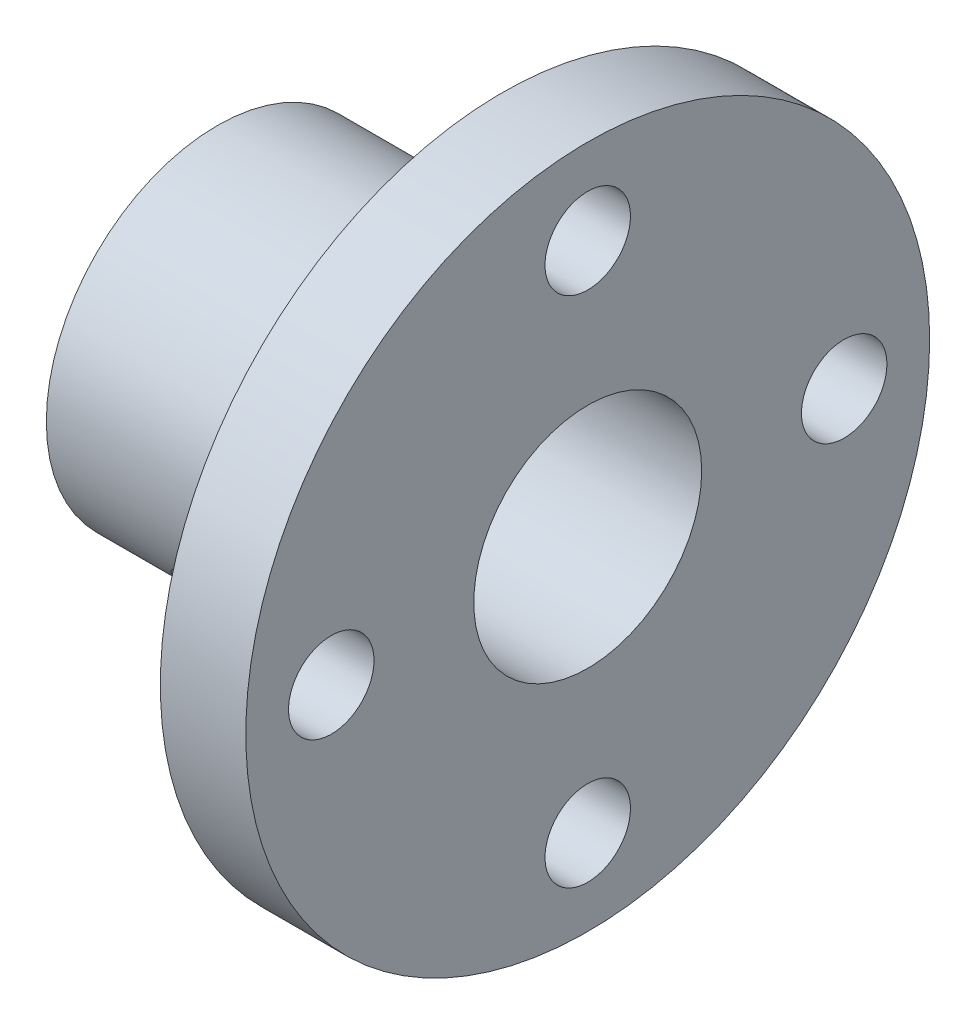
ISO-10303-21;
HEADER;
FILE_DESCRIPTION(('STEP AP214'),'2;1');
FILE_NAME('part.step','',(''),(''),'','','');
FILE_SCHEMA(('AUTOMOTIVE_DESIGN { 1 0 10303 214 1 1 1 1 }'));
ENDSEC;
DATA;
#1=APPLICATION_CONTEXT('core data for automotive mechanical design processes');
#2=APPLICATION_PROTOCOL_DEFINITION('international standard','automotive_design',2000,#1);
#3=PRODUCT_CONTEXT('',#1,'mechanical');
#4=PRODUCT('Part','Part','',(#3));
#5=PRODUCT_RELATED_PRODUCT_CATEGORY('part','',(#4));
#6=PRODUCT_DEFINITION_FORMATION('','',#4);
#7=PRODUCT_DEFINITION_CONTEXT('part definition',#1,'design');
#8=PRODUCT_DEFINITION('design','',#6,#7);
#9=PRODUCT_DEFINITION_SHAPE('','',#8);
#10=(LENGTH_UNIT() NAMED_UNIT(*) SI_UNIT(.MILLI.,.METRE.));
#11=(NAMED_UNIT(*) PLANE_ANGLE_UNIT() SI_UNIT($,.RADIAN.));
#12=(NAMED_UNIT(*) SI_UNIT($,.STERADIAN.) SOLID_ANGLE_UNIT());
#13=UNCERTAINTY_MEASURE_WITH_UNIT(LENGTH_MEASURE(1.E-05),#10,'distance_accuracy_value','');
#14=(GEOMETRIC_REPRESENTATION_CONTEXT(3) GLOBAL_UNCERTAINTY_ASSIGNED_CONTEXT((#13)) GLOBAL_UNIT_ASSIGNED_CONTEXT((#10,
#11,#12)) REPRESENTATION_CONTEXT('',''));
#15=CARTESIAN_POINT('',(0.,0.,0.));
#16=DIRECTION('',(0.,0.,1.));
#17=DIRECTION('',(1.,0.,0.));
#18=AXIS2_PLACEMENT_3D('',#15,#16,#17);
#19=CARTESIAN_POINT('',(0.,0.,0.));
#20=DIRECTION('',(1.,0.,0.));
#21=DIRECTION('',(0.,0.,-1.));
#22=AXIS2_PLACEMENT_3D('',#19,#20,#21);
#23=PLANE('',#22);
#24=CARTESIAN_POINT('',(0.,0.,0.));
#25=DIRECTION('',(1.,0.,0.));
#26=DIRECTION('',(0.,0.,-1.));
#27=AXIS2_PLACEMENT_3D('',#24,#25,#26);
#28=CIRCLE('',#27,6.);
#29=CARTESIAN_POINT('',(0.,0.,-6.));
#30=VERTEX_POINT('',#29);
#31=EDGE_CURVE('E53',#30,#30,#28,.T.);
#32=ORIENTED_EDGE('',*,*,#31,.F.);
#33=EDGE_LOOP('',(#32));
#34=FACE_BOUND('',#33,.T.);
#35=CARTESIAN_POINT('',(0.,0.,0.));
#36=DIRECTION('',(1.,0.,0.));
#37=DIRECTION('',(0.,0.,-1.));
#38=AXIS2_PLACEMENT_3D('',#35,#36,#37);
#39=CIRCLE('',#38,4.);
#40=CARTESIAN_POINT('',(0.,0.,-4.));
#41=VERTEX_POINT('',#40);
#42=EDGE_CURVE('E58',#41,#41,#39,.T.);
#43=ORIENTED_EDGE('',*,*,#42,.T.);
#44=EDGE_LOOP('',(#43));
#45=FACE_BOUND('',#44,.T.);
#46=ADVANCED_FACE('F39',(#34,#45),#23,.F.);
#47=CARTESIAN_POINT('',(10.,0.,0.));
#48=DIRECTION('',(-1.,0.,0.));
#49=DIRECTION('',(0.,0.,1.));
#50=AXIS2_PLACEMENT_3D('',#47,#48,#49);
#51=CYLINDRICAL_SURFACE('',#50,6.);
#52=CARTESIAN_POINT('',(5.,-5.4142135623731,2.5857864376269));
#53=CARTESIAN_POINT('',(4.89106365032786,-5.41421367339716,2.58578581906464));
#54=CARTESIAN_POINT('',(4.78213040035281,-5.41014819596936,2.59435061016488));
#55=CARTESIAN_POINT('',(4.5674911580115,-5.39384853034686,2.62806786551446));
#56=CARTESIAN_POINT('',(4.46178570025506,-5.38161299656149,2.65322306215945));
#57=CARTESIAN_POINT('',(4.25674621400542,-5.3488916005389,2.71858028002119));
#58=CARTESIAN_POINT('',(4.15740014111457,-5.32842190368199,2.75875280822024));
#59=CARTESIAN_POINT('',(3.96727990290408,-5.27905112475486,2.85208634016736));
#60=CARTESIAN_POINT('',(3.87650763489274,-5.25014818224026,2.90525020949271));
#61=CARTESIAN_POINT('',(3.70256007532337,-5.18252142111875,3.02428686095103));
#62=CARTESIAN_POINT('',(3.61976914265654,-5.14348523672956,3.0905439817752));
#63=CARTESIAN_POINT('',(3.46758639755072,-5.05599212218734,3.23169150911136));
#64=CARTESIAN_POINT('',(3.39819673683526,-5.00753368168853,3.30658329893799));
#65=CARTESIAN_POINT('',(3.27304220534081,-4.89988679131185,3.46416443234016));
#66=CARTESIAN_POINT('',(3.21768005876408,-4.84045137072107,3.54700624081533));
#67=CARTESIAN_POINT('',(3.12481682974498,-4.71233932321494,3.71551329250968));
#68=CARTESIAN_POINT('',(3.08731093364619,-4.64366519326446,3.80117776813358));
#69=CARTESIAN_POINT('',(3.03252829073521,-4.50090376224653,3.96907795478367));
#70=CARTESIAN_POINT('',(3.01459310748599,-4.42708793907423,4.05132926050507));
#71=CARTESIAN_POINT('',(2.99736741327868,-4.27394282930696,4.21257197160515));
#72=CARTESIAN_POINT('',(2.99807209669518,-4.19461496905454,4.29156421195778));
#73=CARTESIAN_POINT('',(3.01768850913206,-4.03610452752903,4.44086239154973));
#74=CARTESIAN_POINT('',(3.03588505694898,-3.95703827682759,4.51138750329879));
#75=CARTESIAN_POINT('',(3.08878596196094,-3.79861472982611,4.64556867451801));
#76=CARTESIAN_POINT('',(3.12349143795965,-3.71925741416244,4.70922426808482));
#77=CARTESIAN_POINT('',(3.20884263461212,-3.56184425761549,4.82941087348064));
#78=CARTESIAN_POINT('',(3.25969187709302,-3.48381923326715,4.8858372428726));
#79=CARTESIAN_POINT('',(3.37571941089731,-3.33281997509248,4.99006423046256));
#80=CARTESIAN_POINT('',(3.44090168665526,-3.2598471531575,5.03786244338138));
#81=CARTESIAN_POINT('',(3.5873487869194,-3.11828582416883,5.12675437642831));
#82=CARTESIAN_POINT('',(3.66922631568296,-3.05006549506492,5.16742648489758));
#83=CARTESIAN_POINT('',(3.84489745145324,-2.92487096421327,5.23930856082371));
#84=CARTESIAN_POINT('',(3.93869289145609,-2.8678984958562,5.27051707025631));
#85=CARTESIAN_POINT('',(4.13730725120688,-2.76721684508803,5.32407948334138));
#86=CARTESIAN_POINT('',(4.24226426263555,-2.72370832873974,5.34630080922881));
#87=CARTESIAN_POINT('',(4.45914278842883,-2.65359259011193,5.38144987823174));
#88=CARTESIAN_POINT('',(4.57106136241249,-2.62697828467492,5.39438151649137));
#89=CARTESIAN_POINT('',(4.79327671082315,-2.59315160007579,5.41072119098235));
#90=CARTESIAN_POINT('',(4.90341884949731,-2.585118056162,5.41453257211109));
#91=CARTESIAN_POINT('',(5.12355229822821,-2.58654184961015,5.4138529870662));
#92=CARTESIAN_POINT('',(5.23354363204798,-2.59599601012327,5.40936352883851));
#93=CARTESIAN_POINT('',(5.44631393142382,-2.63115922354569,5.39234233626926));
#94=CARTESIAN_POINT('',(5.54921086030168,-2.65629875204407,5.38009215808304));
#95=CARTESIAN_POINT('',(5.74908721247837,-2.72090683520427,5.34770631519809));
#96=CARTESIAN_POINT('',(5.84606558318156,-2.76037793006264,5.32756925253977));
#97=CARTESIAN_POINT('',(6.034760841694,-2.85316799229887,5.27847167641872));
#98=CARTESIAN_POINT('',(6.1262132852836,-2.9068864745557,5.24925156110975));
#99=CARTESIAN_POINT('',(6.29829210476744,-3.02510471355213,5.18202259596279));
#100=CARTESIAN_POINT('',(6.37891527732244,-3.08960764776319,5.14401115462803));
#101=CARTESIAN_POINT('',(6.53105596818128,-3.23014676318823,5.05700438380528));
#102=CARTESIAN_POINT('',(6.6019487800377,-3.30658852020751,5.00756858869872));
#103=CARTESIAN_POINT('',(6.72783228469609,-3.46544721381249,4.8989712723706));
#104=CARTESIAN_POINT('',(6.78282354232485,-3.54786393803591,4.83981009671387));
#105=CARTESIAN_POINT('',(6.87484020972343,-3.71494697203409,4.71275910400181));
#106=CARTESIAN_POINT('',(6.91198255429613,-3.79959469801113,4.64492989001615));
#107=CARTESIAN_POINT('',(6.96745548412021,-3.96846376981842,4.50150480650533));
#108=CARTESIAN_POINT('',(6.98579285976101,-4.0526852586219,4.4259117513235));
#109=CARTESIAN_POINT('',(7.00252415521128,-4.21379539240546,4.27267005296268));
#110=CARTESIAN_POINT('',(7.00181490786476,-4.29084263585074,4.19528500631328));
#111=CARTESIAN_POINT('',(6.98268538370718,-4.43954603988725,4.03759502264001));
#112=CARTESIAN_POINT('',(6.96426654369446,-4.51120263731888,3.95729032299928));
#113=CARTESIAN_POINT('',(6.91083553084808,-4.64632974310202,3.79768247393403));
#114=CARTESIAN_POINT('',(6.87609156929414,-4.70991219874281,3.71838367648893));
#115=CARTESIAN_POINT('',(6.79124493780569,-4.82918570269499,3.56211158359779));
#116=CARTESIAN_POINT('',(6.74113948960597,-4.88487532084824,3.48513871158532));
#117=CARTESIAN_POINT('',(6.62486097579599,-4.98975939484983,3.33333625794799));
#118=CARTESIAN_POINT('',(6.55816262923672,-5.03863782850207,3.25869095682417));
#119=CARTESIAN_POINT('',(6.41148521768761,-5.12724670538091,3.11742005634198));
#120=CARTESIAN_POINT('',(6.33150191547454,-5.16697422025102,3.05079702741142));
#121=CARTESIAN_POINT('',(6.1567812888261,-5.23877680945592,2.9258536963133));
#122=CARTESIAN_POINT('',(6.06158897804672,-5.27049145198484,2.867960494574));
#123=CARTESIAN_POINT('',(5.86133114619444,-5.32439565946974,2.76660844157981));
#124=CARTESIAN_POINT('',(5.75626821394067,-5.34658771351053,2.7231458190259));
#125=CARTESIAN_POINT('',(5.54407635196874,-5.38088061308738,2.6547185853755));
#126=CARTESIAN_POINT('',(5.43725547294927,-5.39339225586527,2.62900663504154));
#127=CARTESIAN_POINT('',(5.2202878990666,-5.4100572322686,2.59454380025512));
#128=CARTESIAN_POINT('',(5.11014236517858,-5.41421345011992,2.58578706303715));
#129=CARTESIAN_POINT('',(5.,-5.4142135623731,2.5857864376269));
#130=B_SPLINE_CURVE_WITH_KNOTS('',3,(#52,#53,#54,#55,#56,#57,#58,#59,#60,#61,#62,#63,#64,#65,
#66,#67,#68,#69,#70,#71,#72,#73,#74,#75,#76,#77,#78,#79,#80,#81,#82,#83,#84,#85,#86,#87,#88,#89,
#90,#91,#92,#93,#94,#95,#96,#97,#98,#99,#100,#101,#102,#103,#104,#105,#106,#107,#108,#109,#110,
#111,#112,#113,#114,#115,#116,#117,#118,#119,#120,#121,#122,#123,#124,#125,#126,#127,#128,#129),
.UNSPECIFIED.,.T.,.F.,(4,2,2,2,2,2,2,2,2,2,2,2,2,2,2,2,2,2,2,2,2,2,2,2,2,2,2,2,2,2,2,2,2,2,2,2,
2,2,4),(0.,0.326401169598712,0.652856110030328,0.978673255001656,1.30456233237088,
1.64202674855136,1.97954530343976,2.32587012287314,2.67210152773578,3.00628637529868,
3.34038506604655,3.66138009651138,3.98239688378473,4.3076330972067,4.63295983748044,
4.97360348727835,5.31429959224212,5.65985279686111,6.00526102713231,6.33508582728879,
6.66485071674468,6.98328791537552,7.30178158293892,7.6303771547143,7.95906971324255,
8.30357616342185,8.64807037515065,8.99027582381703,9.33235766008313,9.65836169355271,
9.98433928019562,10.3051391208086,10.6259970152649,10.9587103904127,11.2915300886526,
11.6373780547229,11.9831355653373,12.3132642432538,12.6432789438093),.UNSPECIFIED.);
#131=CARTESIAN_POINT('',(5.,-5.4142135623731,2.5857864376269));
#132=VERTEX_POINT('',#131);
#133=EDGE_CURVE('E79',#132,#132,#130,.T.);
#134=ORIENTED_EDGE('',*,*,#133,.T.);
#135=EDGE_LOOP('',(#134));
#136=FACE_BOUND('',#135,.T.);
#137=CARTESIAN_POINT('',(10.,0.,0.));
#138=DIRECTION('',(1.,0.,0.));
#139=DIRECTION('',(0.,0.,-1.));
#140=AXIS2_PLACEMENT_3D('',#137,#138,#139);
#141=CIRCLE('',#140,6.);
#142=CARTESIAN_POINT('',(10.,0.,-6.));
#143=VERTEX_POINT('',#142);
#144=EDGE_CURVE('E10',#143,#143,#141,.T.);
#145=ORIENTED_EDGE('',*,*,#144,.F.);
#146=EDGE_LOOP('',(#145));
#147=FACE_BOUND('',#146,.T.);
#148=ORIENTED_EDGE('',*,*,#31,.T.);
#149=EDGE_LOOP('',(#148));
#150=FACE_BOUND('',#149,.T.);
#151=ADVANCED_FACE('F41',(#136,#147,#150),#51,.T.);
#152=CARTESIAN_POINT('',(10.,0.,0.));
#153=DIRECTION('',(-1.,0.,0.));
#154=DIRECTION('',(0.,0.,1.));
#155=AXIS2_PLACEMENT_3D('',#152,#153,#154);
#156=CYLINDRICAL_SURFACE('',#155,4.);
#157=CARTESIAN_POINT('',(5.,-3.86370330515628,1.03527618041007));
#158=CARTESIAN_POINT('',(4.89578679452566,-3.86370459881445,1.03528937115708));
#159=CARTESIAN_POINT('',(4.7914378234662,-3.86128100934838,1.04445095043977));
#160=CARTESIAN_POINT('',(4.5859448227694,-3.8513940803619,1.08031794598723));
#161=CARTESIAN_POINT('',(4.48480799675224,-3.84392015002067,1.10706022667329));
#162=CARTESIAN_POINT('',(4.28909684355307,-3.82345847525807,1.17576810402631));
#163=CARTESIAN_POINT('',(4.19449074115075,-3.81049999591904,1.21765273191302));
#164=CARTESIAN_POINT('',(4.01315154952385,-3.77834613351914,1.3140294011476));
#165=CARTESIAN_POINT('',(3.92641888656323,-3.75915041303458,1.36852212452517));
#166=CARTESIAN_POINT('',(3.75538855686661,-3.71179474047926,1.49242262258694));
#167=CARTESIAN_POINT('',(3.67188173240823,-3.68302601797015,1.56268986729789));
#168=CARTESIAN_POINT('',(3.5171832194294,-3.61610679381541,1.71185746004075));
#169=CARTESIAN_POINT('',(3.44599767379603,-3.57795163529629,1.79076208249942));
#170=CARTESIAN_POINT('',(3.3132656988115,-3.48844672204306,1.95971138096948));
#171=CARTESIAN_POINT('',(3.25269246457669,-3.43638092272623,2.05014845548511));
#172=CARTESIAN_POINT('',(3.14971829321291,-3.32009909967182,2.2335389452809));
#173=CARTESIAN_POINT('',(3.1073058876492,-3.25589078089575,2.32649073298614));
#174=CARTESIAN_POINT('',(3.04499067746882,-3.12095657273504,2.5042323389679));
#175=CARTESIAN_POINT('',(3.0237009473079,-3.05101952081115,2.58913230708546));
#176=CARTESIAN_POINT('',(2.99966776263097,-2.9028804726123,2.75418828042583));
#177=CARTESIAN_POINT('',(2.99691308640372,-2.82468350628805,2.83434712692782));
#178=CARTESIAN_POINT('',(3.00949334794514,-2.66974853723373,2.98040182849614));
#179=CARTESIAN_POINT('',(3.02327603104364,-2.59347500057567,3.04693182899991));
#180=CARTESIAN_POINT('',(3.06576168780812,-2.43871042756158,3.17216053387481));
#181=CARTESIAN_POINT('',(3.09446577795212,-2.36021922568682,3.23085865182079));
#182=CARTESIAN_POINT('',(3.16616513217995,-2.20250531142358,3.34040810707924));
#183=CARTESIAN_POINT('',(3.20935262634422,-2.12328750299557,3.39113964482629));
#184=CARTESIAN_POINT('',(3.3085268324029,-1.96773626752488,3.48370759115981));
#185=CARTESIAN_POINT('',(3.36451812660467,-1.89140388456176,3.52554080478517));
#186=CARTESIAN_POINT('',(3.49379070306606,-1.73703649261152,3.60428958213898));
#187=CARTESIAN_POINT('',(3.56820605665203,-1.65952260135774,3.64036649555481));
#188=CARTESIAN_POINT('',(3.72917944986035,-1.51382940179715,3.70332720013195));
#189=CARTESIAN_POINT('',(3.81574674454812,-1.44565728724411,3.73020393016802));
#190=CARTESIAN_POINT('',(4.00529638484818,-1.31795685047571,3.77728932408925));
#191=CARTESIAN_POINT('',(4.10897204610842,-1.2592523627547,3.79696615323056));
#192=CARTESIAN_POINT('',(4.325875342718,-1.16027085528414,3.82838022178833));
#193=CARTESIAN_POINT('',(4.43909286603513,-1.11997461107767,3.84012575033586));
#194=CARTESIAN_POINT('',(4.66242902256558,-1.06386498780705,3.85603227368293));
#195=CARTESIAN_POINT('',(4.7720822380871,-1.04636450399108,3.8607205491991));
#196=CARTESIAN_POINT('',(4.99280268303309,-1.03189824566564,3.86461594335437));
#197=CARTESIAN_POINT('',(5.1038688582396,-1.03491796578462,3.86382693378153));
#198=CARTESIAN_POINT('',(5.31130783715744,-1.05968057724539,3.8570969495911));
#199=CARTESIAN_POINT('',(5.40795890221578,-1.07933918703678,3.85172899517205));
#200=CARTESIAN_POINT('',(5.59673557254199,-1.133130033821,3.83624732829456));
#201=CARTESIAN_POINT('',(5.68885970149348,-1.16726695795746,3.82613207885531));
#202=CARTESIAN_POINT('',(5.87082266180512,-1.24976121811306,3.80000571468505));
#203=CARTESIAN_POINT('',(5.96035803370605,-1.29870394849984,3.7837432298891));
#204=CARTESIAN_POINT('',(6.13093854307904,-1.40753017427796,3.74462291896735));
#205=CARTESIAN_POINT('',(6.21197928703051,-1.46741928775996,3.7217617026214));
#206=CARTESIAN_POINT('',(6.37395753504266,-1.6037787326291,3.66524154585663));
#207=CARTESIAN_POINT('',(6.45359430141778,-1.68138757944599,3.63058476054876));
#208=CARTESIAN_POINT('',(6.59882447600473,-1.84404659815512,3.5507322401369));
#209=CARTESIAN_POINT('',(6.66441314052684,-1.92909927002595,3.50553295582569));
#210=CARTESIAN_POINT('',(6.78114745183271,-2.10559182003166,3.4025256771348));
#211=CARTESIAN_POINT('',(6.83186623616677,-2.19714102664404,3.3444163981957));
#212=CARTESIAN_POINT('',(6.91427580796961,-2.38056150742933,3.21642497959979));
#213=CARTESIAN_POINT('',(6.9459833036841,-2.47243242721347,3.14655324686927));
#214=CARTESIAN_POINT('',(6.98673712748514,-2.64414859154453,3.0033013691683));
#215=CARTESIAN_POINT('',(6.99759574866428,-2.72432380326584,2.93083135085754));
#216=CARTESIAN_POINT('',(7.00168653399567,-2.87869858365823,2.77934729282198));
#217=CARTESIAN_POINT('',(6.99492486852887,-2.95290023480644,2.70033555329972));
#218=CARTESIAN_POINT('',(6.9651671756836,-3.08846943561531,2.54388975347636));
#219=CARTESIAN_POINT('',(6.94327026269095,-3.15036049200076,2.466694808232));
#220=CARTESIAN_POINT('',(6.88534604019333,-3.26593797100564,2.31149669440088));
#221=CARTESIAN_POINT('',(6.84931670429309,-3.31962321548963,2.23349341147186));
#222=CARTESIAN_POINT('',(6.7625457450086,-3.42053391102494,2.0758334232129));
#223=CARTESIAN_POINT('',(6.71124078024814,-3.4673848676352,1.9962486921663));
#224=CARTESIAN_POINT('',(6.59608471188191,-3.55201788731207,1.84145699969248));
#225=CARTESIAN_POINT('',(6.53222784589843,-3.58979576730868,1.7662520695952));
#226=CARTESIAN_POINT('',(6.38640336444059,-3.66026791477986,1.61555786947552));
#227=CARTESIAN_POINT('',(6.30326581919971,-3.69208209776399,1.54078515186371));
#228=CARTESIAN_POINT('',(6.12510777169391,-3.74666670664265,1.40285481283077));
#229=CARTESIAN_POINT('',(6.03007686863948,-3.76942914306031,1.33970747877438));
#230=CARTESIAN_POINT('',(5.82669110586976,-3.80767032151753,1.22691845246329));
#231=CARTESIAN_POINT('',(5.71801008926473,-3.82289615256722,1.17776662816842));
#232=CARTESIAN_POINT('',(5.54942188036906,-3.84024140403409,1.11935207552341));
#233=CARTESIAN_POINT('',(5.49235217940932,-3.84510564702044,1.10244115407727));
#234=CARTESIAN_POINT('',(5.37676744249981,-3.8531247587118,1.07408098437129));
#235=CARTESIAN_POINT('',(5.31825344724575,-3.85628082270828,1.06262791767175));
#236=CARTESIAN_POINT('',(5.21639921075271,-3.86032188599498,1.04783389616824));
#237=CARTESIAN_POINT('',(5.17326694274993,-3.86159132004936,1.04313310007071));
#238=CARTESIAN_POINT('',(5.0867643069071,-3.86328178867122,1.03685139155019));
#239=CARTESIAN_POINT('',(5.0433939233333,-3.86370276648267,1.03527068784067));
#240=CARTESIAN_POINT('',(5.,-3.86370330515628,1.03527618041007));
#241=B_SPLINE_CURVE_WITH_KNOTS('',3,(#157,#158,#159,#160,#161,#162,#163,#164,#165,#166,#167,
#168,#169,#170,#171,#172,#173,#174,#175,#176,#177,#178,#179,#180,#181,#182,#183,#184,#185,#186,
#187,#188,#189,#190,#191,#192,#193,#194,#195,#196,#197,#198,#199,#200,#201,#202,#203,#204,#205,
#206,#207,#208,#209,#210,#211,#212,#213,#214,#215,#216,#217,#218,#219,#220,#221,#222,#223,#224,
#225,#226,#227,#228,#229,#230,#231,#232,#233,#234,#235,#236,#237,#238,#239,#240),.UNSPECIFIED.,
.T.,.F.,(4,2,2,2,2,2,2,2,2,2,2,2,2,2,2,2,2,2,2,2,2,2,2,2,2,2,2,2,2,2,2,2,2,2,2,2,2,2,2,2,2,4),
(0.,0.312464245189432,0.62558578564961,0.937057191861536,1.24854545093097,1.58572462503713,
1.92307142172809,2.28315784481594,2.64301653931849,2.97726969939937,3.31132047376147,
3.61632194973143,3.92134625038977,4.2305906946636,4.5399459870461,4.87854382917848,
5.21740096495904,5.57777683462964,5.93777548427477,6.2692458171249,6.60048186380813,
6.89548366852118,7.19058104876193,7.49934592816242,7.80826972444162,8.15613487165293,
8.50411729960471,8.86128362829998,9.2181355962161,9.5422454078304,9.8662417359201,
10.1688884974705,10.4715786702809,10.7872150144301,11.1029966020551,11.450204837042,
11.7977188569438,12.1562149808128,12.3351395323571,12.5139387197526,12.6440387634036,
12.7741475095882),.UNSPECIFIED.);
#242=CARTESIAN_POINT('',(5.,-3.86370330515628,1.03527618041007));
#243=VERTEX_POINT('',#242);
#244=EDGE_CURVE('E44',#243,#243,#241,.T.);
#245=ORIENTED_EDGE('',*,*,#244,.F.);
#246=EDGE_LOOP('',(#245));
#247=FACE_BOUND('',#246,.T.);
#248=ORIENTED_EDGE('',*,*,#42,.F.);
#249=EDGE_LOOP('',(#248));
#250=FACE_BOUND('',#249,.T.);
#251=CARTESIAN_POINT('',(13.,0.,0.));
#252=DIRECTION('',(1.,0.,0.));
#253=DIRECTION('',(0.,0.,-1.));
#254=AXIS2_PLACEMENT_3D('',#251,#252,#253);
#255=CIRCLE('',#254,4.);
#256=CARTESIAN_POINT('',(13.,0.,-4.));
#257=VERTEX_POINT('',#256);
#258=EDGE_CURVE('E62',#257,#257,#255,.F.);
#259=ORIENTED_EDGE('',*,*,#258,.F.);
#260=EDGE_LOOP('',(#259));
#261=FACE_BOUND('',#260,.T.);
#262=ADVANCED_FACE('F118',(#247,#250,#261),#156,.F.);
#263=CARTESIAN_POINT('',(13.,0.,0.));
#264=DIRECTION('',(-1.,0.,0.));
#265=DIRECTION('',(0.,0.,1.));
#266=AXIS2_PLACEMENT_3D('',#263,#264,#265);
#267=CYLINDRICAL_SURFACE('',#266,12.);
#268=CARTESIAN_POINT('',(13.,0.,0.));
#269=DIRECTION('',(1.,0.,0.));
#270=DIRECTION('',(0.,0.,-1.));
#271=AXIS2_PLACEMENT_3D('',#268,#269,#270);
#272=CIRCLE('',#271,12.);
#273=CARTESIAN_POINT('',(13.,0.,-12.));
#274=VERTEX_POINT('',#273);
#275=EDGE_CURVE('E82',#274,#274,#272,.T.);
#276=ORIENTED_EDGE('',*,*,#275,.F.);
#277=EDGE_LOOP('',(#276));
#278=FACE_BOUND('',#277,.T.);
#279=CARTESIAN_POINT('',(10.,0.,0.));
#280=DIRECTION('',(1.,0.,0.));
#281=DIRECTION('',(0.,0.,-1.));
#282=AXIS2_PLACEMENT_3D('',#279,#280,#281);
#283=CIRCLE('',#282,12.);
#284=CARTESIAN_POINT('',(10.,0.,-12.));
#285=VERTEX_POINT('',#284);
#286=EDGE_CURVE('E63',#285,#285,#283,.T.);
#287=ORIENTED_EDGE('',*,*,#286,.T.);
#288=EDGE_LOOP('',(#287));
#289=FACE_BOUND('',#288,.T.);
#290=ADVANCED_FACE('F114',(#278,#289),#267,.T.);
#291=CARTESIAN_POINT('',(13.,-9.,0.));
#292=DIRECTION('',(-1.,0.,0.));
#293=DIRECTION('',(0.,0.,1.));
#294=AXIS2_PLACEMENT_3D('',#291,#292,#293);
#295=CYLINDRICAL_SURFACE('',#294,1.5);
#296=CARTESIAN_POINT('',(13.,-9.,0.));
#297=DIRECTION('',(1.,0.,0.));
#298=DIRECTION('',(0.,0.,-1.));
#299=AXIS2_PLACEMENT_3D('',#296,#297,#298);
#300=CIRCLE('',#299,1.5);
#301=CARTESIAN_POINT('',(13.,-9.,-1.4999999999999));
#302=VERTEX_POINT('',#301);
#303=EDGE_CURVE('E85',#302,#302,#300,.T.);
#304=ORIENTED_EDGE('',*,*,#303,.T.);
#305=EDGE_LOOP('',(#304));
#306=FACE_BOUND('',#305,.T.);
#307=CARTESIAN_POINT('',(10.,-9.,0.));
#308=DIRECTION('',(1.,0.,0.));
#309=DIRECTION('',(0.,0.,-1.));
#310=AXIS2_PLACEMENT_3D('',#307,#308,#309);
#311=CIRCLE('',#310,1.5);
#312=CARTESIAN_POINT('',(10.,-9.,-1.4999999999999));
#313=VERTEX_POINT('',#312);
#314=EDGE_CURVE('E67',#313,#313,#311,.T.);
#315=ORIENTED_EDGE('',*,*,#314,.F.);
#316=EDGE_LOOP('',(#315));
#317=FACE_BOUND('',#316,.T.);
#318=ADVANCED_FACE('F117',(#306,#317),#295,.F.);
#319=CARTESIAN_POINT('',(13.,0.,-9.));
#320=DIRECTION('',(-1.,0.,0.));
#321=DIRECTION('',(0.,0.,1.));
#322=AXIS2_PLACEMENT_3D('',#319,#320,#321);
#323=CYLINDRICAL_SURFACE('',#322,1.5);
#324=CARTESIAN_POINT('',(13.,0.,-9.));
#325=DIRECTION('',(1.,0.,0.));
#326=DIRECTION('',(0.,0.,-1.));
#327=AXIS2_PLACEMENT_3D('',#324,#325,#326);
#328=CIRCLE('',#327,1.5);
#329=CARTESIAN_POINT('',(13.,0.,-10.5));
#330=VERTEX_POINT('',#329);
#331=EDGE_CURVE('E88',#330,#330,#328,.T.);
#332=ORIENTED_EDGE('',*,*,#331,.T.);
#333=EDGE_LOOP('',(#332));
#334=FACE_BOUND('',#333,.T.);
#335=CARTESIAN_POINT('',(10.,0.,-9.));
#336=DIRECTION('',(1.,0.,0.));
#337=DIRECTION('',(0.,0.,-1.));
#338=AXIS2_PLACEMENT_3D('',#335,#336,#337);
#339=CIRCLE('',#338,1.5);
#340=CARTESIAN_POINT('',(10.,0.,-10.5));
#341=VERTEX_POINT('',#340);
#342=EDGE_CURVE('E70',#341,#341,#339,.T.);
#343=ORIENTED_EDGE('',*,*,#342,.F.);
#344=EDGE_LOOP('',(#343));
#345=FACE_BOUND('',#344,.T.);
#346=ADVANCED_FACE('F122',(#334,#345),#323,.F.);
#347=CARTESIAN_POINT('',(13.,9.,0.));
#348=DIRECTION('',(-1.,0.,0.));
#349=DIRECTION('',(0.,0.,1.));
#350=AXIS2_PLACEMENT_3D('',#347,#348,#349);
#351=CYLINDRICAL_SURFACE('',#350,1.5);
#352=CARTESIAN_POINT('',(13.,9.,0.));
#353=DIRECTION('',(1.,0.,0.));
#354=DIRECTION('',(0.,0.,-1.));
#355=AXIS2_PLACEMENT_3D('',#352,#353,#354);
#356=CIRCLE('',#355,1.5);
#357=CARTESIAN_POINT('',(13.,9.,-1.50000000000003));
#358=VERTEX_POINT('',#357);
#359=EDGE_CURVE('E91',#358,#358,#356,.T.);
#360=ORIENTED_EDGE('',*,*,#359,.T.);
#361=EDGE_LOOP('',(#360));
#362=FACE_BOUND('',#361,.T.);
#363=CARTESIAN_POINT('',(10.,9.,0.));
#364=DIRECTION('',(1.,0.,0.));
#365=DIRECTION('',(0.,0.,-1.));
#366=AXIS2_PLACEMENT_3D('',#363,#364,#365);
#367=CIRCLE('',#366,1.5);
#368=CARTESIAN_POINT('',(10.,9.,-1.50000000000003));
#369=VERTEX_POINT('',#368);
#370=EDGE_CURVE('E73',#369,#369,#367,.T.);
#371=ORIENTED_EDGE('',*,*,#370,.F.);
#372=EDGE_LOOP('',(#371));
#373=FACE_BOUND('',#372,.T.);
#374=ADVANCED_FACE('F126',(#362,#373),#351,.F.);
#375=CARTESIAN_POINT('',(13.,0.,9.));
#376=DIRECTION('',(-1.,0.,0.));
#377=DIRECTION('',(0.,0.,1.));
#378=AXIS2_PLACEMENT_3D('',#375,#376,#377);
#379=CYLINDRICAL_SURFACE('',#378,1.5);
#380=CARTESIAN_POINT('',(13.,0.,9.));
#381=DIRECTION('',(1.,0.,0.));
#382=DIRECTION('',(0.,0.,-1.));
#383=AXIS2_PLACEMENT_3D('',#380,#381,#382);
#384=CIRCLE('',#383,1.5);
#385=CARTESIAN_POINT('',(13.,0.,7.5));
#386=VERTEX_POINT('',#385);
#387=EDGE_CURVE('E66',#386,#386,#384,.T.);
#388=ORIENTED_EDGE('',*,*,#387,.T.);
#389=EDGE_LOOP('',(#388));
#390=FACE_BOUND('',#389,.T.);
#391=CARTESIAN_POINT('',(10.,0.,9.));
#392=DIRECTION('',(1.,0.,0.));
#393=DIRECTION('',(0.,0.,-1.));
#394=AXIS2_PLACEMENT_3D('',#391,#392,#393);
#395=CIRCLE('',#394,1.5);
#396=CARTESIAN_POINT('',(10.,0.,7.5));
#397=VERTEX_POINT('',#396);
#398=EDGE_CURVE('E76',#397,#397,#395,.T.);
#399=ORIENTED_EDGE('',*,*,#398,.F.);
#400=EDGE_LOOP('',(#399));
#401=FACE_BOUND('',#400,.T.);
#402=ADVANCED_FACE('F110',(#390,#401),#379,.F.);
#403=CARTESIAN_POINT('',(13.,0.,0.));
#404=DIRECTION('',(1.,0.,0.));
#405=DIRECTION('',(0.,0.,-1.));
#406=AXIS2_PLACEMENT_3D('',#403,#404,#405);
#407=PLANE('',#406);
#408=ORIENTED_EDGE('',*,*,#387,.F.);
#409=EDGE_LOOP('',(#408));
#410=FACE_BOUND('',#409,.T.);
#411=ORIENTED_EDGE('',*,*,#359,.F.);
#412=EDGE_LOOP('',(#411));
#413=FACE_BOUND('',#412,.T.);
#414=ORIENTED_EDGE('',*,*,#331,.F.);
#415=EDGE_LOOP('',(#414));
#416=FACE_BOUND('',#415,.T.);
#417=ORIENTED_EDGE('',*,*,#303,.F.);
#418=EDGE_LOOP('',(#417));
#419=FACE_BOUND('',#418,.T.);
#420=ORIENTED_EDGE('',*,*,#275,.T.);
#421=EDGE_LOOP('',(#420));
#422=FACE_BOUND('',#421,.T.);
#423=ORIENTED_EDGE('',*,*,#258,.T.);
#424=EDGE_LOOP('',(#423));
#425=FACE_BOUND('',#424,.T.);
#426=ADVANCED_FACE('F106',(#410,#413,#416,#419,#422,#425),#407,.T.);
#427=CARTESIAN_POINT('',(10.,0.,0.));
#428=DIRECTION('',(1.,0.,0.));
#429=DIRECTION('',(0.,0.,-1.));
#430=AXIS2_PLACEMENT_3D('',#427,#428,#429);
#431=PLANE('',#430);
#432=ORIENTED_EDGE('',*,*,#144,.T.);
#433=EDGE_LOOP('',(#432));
#434=FACE_BOUND('',#433,.T.);
#435=ORIENTED_EDGE('',*,*,#398,.T.);
#436=EDGE_LOOP('',(#435));
#437=FACE_BOUND('',#436,.T.);
#438=ORIENTED_EDGE('',*,*,#370,.T.);
#439=EDGE_LOOP('',(#438));
#440=FACE_BOUND('',#439,.T.);
#441=ORIENTED_EDGE('',*,*,#342,.T.);
#442=EDGE_LOOP('',(#441));
#443=FACE_BOUND('',#442,.T.);
#444=ORIENTED_EDGE('',*,*,#314,.T.);
#445=EDGE_LOOP('',(#444));
#446=FACE_BOUND('',#445,.T.);
#447=ORIENTED_EDGE('',*,*,#286,.F.);
#448=EDGE_LOOP('',(#447));
#449=FACE_BOUND('',#448,.T.);
#450=ADVANCED_FACE('F104',(#434,#437,#440,#443,#446,#449),#431,.F.);
#451=CARTESIAN_POINT('',(5.,-2.12132034355965,2.12132034355964));
#452=DIRECTION('',(0.,-0.707106781186549,0.707106781186546));
#453=DIRECTION('',(0.,-0.707106781186546,-0.707106781186549));
#454=AXIS2_PLACEMENT_3D('',#451,#452,#453);
#455=CYLINDRICAL_SURFACE('',#454,2.);
#456=ORIENTED_EDGE('',*,*,#244,.T.);
#457=EDGE_LOOP('',(#456));
#458=FACE_BOUND('',#457,.T.);
#459=ORIENTED_EDGE('',*,*,#133,.F.);
#460=EDGE_LOOP('',(#459));
#461=FACE_BOUND('',#460,.T.);
#462=ADVANCED_FACE('F100',(#458,#461),#455,.F.);
#463=CLOSED_SHELL('',(#46,#151,#262,#290,#318,#346,#374,#402,#426,#450,#462));
#464=MANIFOLD_SOLID_BREP('B2',#463);
#465=ADVANCED_BREP_SHAPE_REPRESENTATION('',(#18,#464),#14);
#466=SHAPE_DEFINITION_REPRESENTATION(#9,#465);
ENDSEC;
END-ISO-10303-21;
